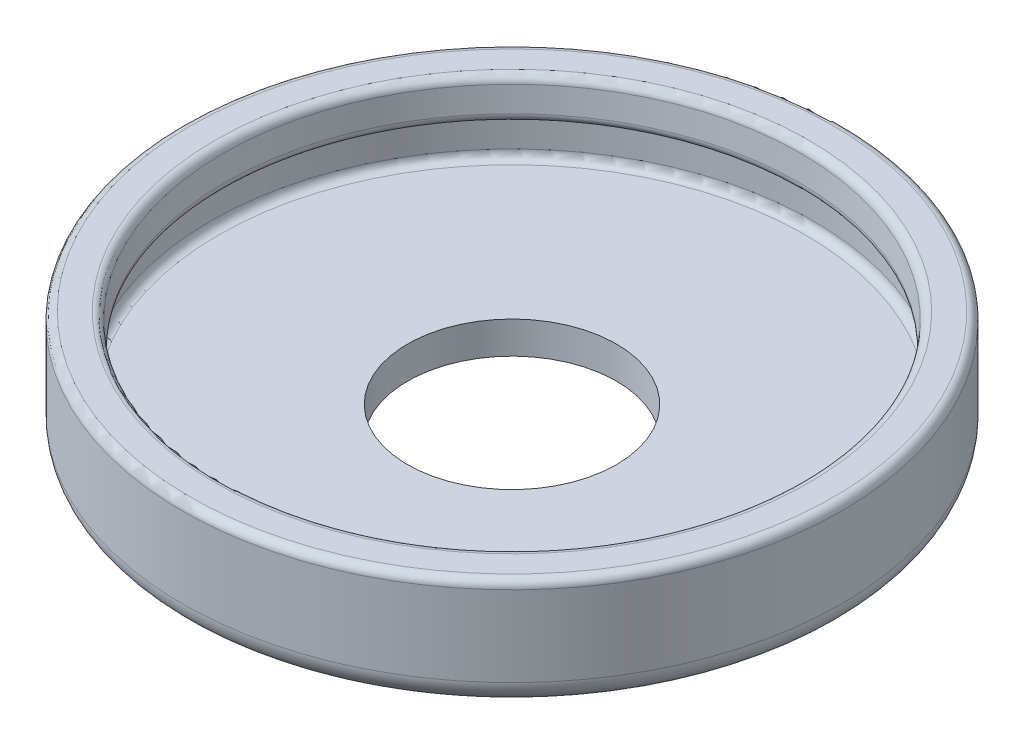
ISO-10303-21;
HEADER;
FILE_DESCRIPTION(('STEP AP214'),'2;1');
FILE_NAME('part.step','',(''),(''),'','','');
FILE_SCHEMA(('AUTOMOTIVE_DESIGN { 1 0 10303 214 1 1 1 1 }'));
ENDSEC;
DATA;
#1=APPLICATION_CONTEXT('core data for automotive mechanical design processes');
#2=APPLICATION_PROTOCOL_DEFINITION('international standard','automotive_design',2000,#1);
#3=PRODUCT_CONTEXT('',#1,'mechanical');
#4=PRODUCT('Part','Part','',(#3));
#5=PRODUCT_RELATED_PRODUCT_CATEGORY('part','',(#4));
#6=PRODUCT_DEFINITION_FORMATION('','',#4);
#7=PRODUCT_DEFINITION_CONTEXT('part definition',#1,'design');
#8=PRODUCT_DEFINITION('design','',#6,#7);
#9=PRODUCT_DEFINITION_SHAPE('','',#8);
#10=(LENGTH_UNIT() NAMED_UNIT(*) SI_UNIT(.MILLI.,.METRE.));
#11=(NAMED_UNIT(*) PLANE_ANGLE_UNIT() SI_UNIT($,.RADIAN.));
#12=(NAMED_UNIT(*) SI_UNIT($,.STERADIAN.) SOLID_ANGLE_UNIT());
#13=UNCERTAINTY_MEASURE_WITH_UNIT(LENGTH_MEASURE(1.E-05),#10,'distance_accuracy_value','');
#14=(GEOMETRIC_REPRESENTATION_CONTEXT(3) GLOBAL_UNCERTAINTY_ASSIGNED_CONTEXT((#13)) GLOBAL_UNIT_ASSIGNED_CONTEXT((#10,
#11,#12)) REPRESENTATION_CONTEXT('',''));
#15=CARTESIAN_POINT('',(0.,0.,0.));
#16=DIRECTION('',(0.,0.,1.));
#17=DIRECTION('',(1.,0.,0.));
#18=AXIS2_PLACEMENT_3D('',#15,#16,#17);
#19=CARTESIAN_POINT('',(0.,-28.2915831066601,0.));
#20=DIRECTION('',(0.,-1.,0.));
#21=DIRECTION('',(1.,0.,0.));
#22=AXIS2_PLACEMENT_3D('',#19,#20,#21);
#23=CYLINDRICAL_SURFACE('',#22,1.651);
#24=CARTESIAN_POINT('',(0.,0.,0.));
#25=DIRECTION('',(0.,-1.,0.));
#26=DIRECTION('',(1.,0.,0.));
#27=AXIS2_PLACEMENT_3D('',#24,#25,#26);
#28=CIRCLE('',#27,1.651);
#29=CARTESIAN_POINT('',(1.651,0.,0.));
#30=VERTEX_POINT('',#29);
#31=EDGE_CURVE('E72',#30,#30,#28,.T.);
#32=ORIENTED_EDGE('',*,*,#31,.T.);
#33=EDGE_LOOP('',(#32));
#34=FACE_BOUND('',#33,.T.);
#35=CARTESIAN_POINT('',(0.,0.507999999999995,0.));
#36=DIRECTION('',(0.,-1.,0.));
#37=DIRECTION('',(1.,0.,0.));
#38=AXIS2_PLACEMENT_3D('',#35,#36,#37);
#39=CIRCLE('',#38,1.651);
#40=CARTESIAN_POINT('',(1.651,0.508,0.));
#41=VERTEX_POINT('',#40);
#42=EDGE_CURVE('E78',#41,#41,#39,.T.);
#43=ORIENTED_EDGE('',*,*,#42,.F.);
#44=EDGE_LOOP('',(#43));
#45=FACE_BOUND('',#44,.T.);
#46=ADVANCED_FACE('F34',(#34,#45),#23,.F.);
#47=CARTESIAN_POINT('',(1.651,0.,0.));
#48=DIRECTION('',(0.,-1.,0.));
#49=DIRECTION('',(1.,0.,0.));
#50=AXIS2_PLACEMENT_3D('',#47,#48,#49);
#51=PLANE('',#50);
#52=CARTESIAN_POINT('',(0.,0.,0.));
#53=DIRECTION('',(0.,-1.,0.));
#54=DIRECTION('',(1.,0.,0.));
#55=AXIS2_PLACEMENT_3D('',#52,#53,#54);
#56=CIRCLE('',#55,4.826);
#57=CARTESIAN_POINT('',(4.826,0.,0.));
#58=VERTEX_POINT('',#57);
#59=EDGE_CURVE('E69',#58,#58,#56,.T.);
#60=ORIENTED_EDGE('',*,*,#59,.T.);
#61=EDGE_LOOP('',(#60));
#62=FACE_BOUND('',#61,.T.);
#63=ORIENTED_EDGE('',*,*,#31,.F.);
#64=EDGE_LOOP('',(#63));
#65=FACE_BOUND('',#64,.T.);
#66=ADVANCED_FACE('F85',(#62,#65),#51,.T.);
#67=CARTESIAN_POINT('',(0.,-28.2915831066601,0.));
#68=DIRECTION('',(0.,-1.,0.));
#69=DIRECTION('',(1.,0.,0.));
#70=AXIS2_PLACEMENT_3D('',#67,#68,#69);
#71=CYLINDRICAL_SURFACE('',#70,5.207);
#72=CARTESIAN_POINT('',(0.,1.65099999999998,0.));
#73=DIRECTION('',(0.,1.,0.));
#74=DIRECTION('',(-1.,0.,0.));
#75=AXIS2_PLACEMENT_3D('',#72,#73,#74);
#76=CIRCLE('',#75,5.207);
#77=CARTESIAN_POINT('',(-5.20700000000001,1.65099999999996,0.));
#78=VERTEX_POINT('',#77);
#79=EDGE_CURVE('E10',#78,#78,#76,.F.);
#80=ORIENTED_EDGE('',*,*,#79,.T.);
#81=EDGE_LOOP('',(#80));
#82=FACE_BOUND('',#81,.T.);
#83=CARTESIAN_POINT('',(0.,0.380999999999986,0.));
#84=DIRECTION('',(0.,-1.,0.));
#85=DIRECTION('',(1.,0.,0.));
#86=AXIS2_PLACEMENT_3D('',#83,#84,#85);
#87=CIRCLE('',#86,5.207);
#88=CARTESIAN_POINT('',(5.207,0.381000000000003,0.));
#89=VERTEX_POINT('',#88);
#90=EDGE_CURVE('E66',#89,#89,#87,.F.);
#91=ORIENTED_EDGE('',*,*,#90,.T.);
#92=EDGE_LOOP('',(#91));
#93=FACE_BOUND('',#92,.T.);
#94=ADVANCED_FACE('F92',(#82,#93),#71,.T.);
#95=CARTESIAN_POINT('',(5.207,1.778,0.));
#96=DIRECTION('',(0.,1.,0.));
#97=DIRECTION('',(-1.,0.,0.));
#98=AXIS2_PLACEMENT_3D('',#95,#96,#97);
#99=PLANE('',#98);
#100=CARTESIAN_POINT('',(0.,1.77799999999998,0.));
#101=DIRECTION('',(0.,1.,0.));
#102=DIRECTION('',(-1.,0.,0.));
#103=AXIS2_PLACEMENT_3D('',#100,#101,#102);
#104=CIRCLE('',#103,4.68924575183249);
#105=CARTESIAN_POINT('',(-4.68924575183249,1.77799999999997,0.));
#106=VERTEX_POINT('',#105);
#107=EDGE_CURVE('E41',#106,#106,#104,.F.);
#108=ORIENTED_EDGE('',*,*,#107,.T.);
#109=EDGE_LOOP('',(#108));
#110=FACE_BOUND('',#109,.T.);
#111=CARTESIAN_POINT('',(0.,1.77799999999998,0.));
#112=DIRECTION('',(0.,1.,0.));
#113=DIRECTION('',(-1.,0.,0.));
#114=AXIS2_PLACEMENT_3D('',#111,#112,#113);
#115=CIRCLE('',#114,5.08);
#116=CARTESIAN_POINT('',(-5.08000000000001,1.77799999999997,0.));
#117=VERTEX_POINT('',#116);
#118=EDGE_CURVE('E45',#117,#117,#115,.T.);
#119=ORIENTED_EDGE('',*,*,#118,.T.);
#120=EDGE_LOOP('',(#119));
#121=FACE_BOUND('',#120,.T.);
#122=ADVANCED_FACE('F121',(#110,#121),#99,.T.);
#123=CARTESIAN_POINT('',(0.,1.77799999999998,0.));
#124=DIRECTION('',(0.,1.,0.));
#125=DIRECTION('',(-1.,0.,0.));
#126=AXIS2_PLACEMENT_3D('',#123,#124,#125);
#127=CONICAL_SURFACE('',#126,4.57200000000001,0.0798299857122402);
#128=CARTESIAN_POINT('',(0.,1.28012764322991,0.));
#129=DIRECTION('',(0.,-1.,0.));
#130=DIRECTION('',(1.,0.,0.));
#131=AXIS2_PLACEMENT_3D('',#128,#129,#130);
#132=CIRCLE('',#131,4.5321702114584);
#133=CARTESIAN_POINT('',(4.53217021145839,1.28012764322993,0.));
#134=VERTEX_POINT('',#133);
#135=EDGE_CURVE('E54',#134,#134,#132,.T.);
#136=ORIENTED_EDGE('',*,*,#135,.T.);
#137=EDGE_LOOP('',(#136));
#138=FACE_BOUND('',#137,.T.);
#139=CARTESIAN_POINT('',(0.,1.66112764322991,0.));
#140=DIRECTION('',(0.,-1.,0.));
#141=DIRECTION('',(1.,0.,0.));
#142=AXIS2_PLACEMENT_3D('',#139,#140,#141);
#143=CIRCLE('',#142,4.5626502114584);
#144=CARTESIAN_POINT('',(4.56265021145839,1.66112764322993,0.));
#145=VERTEX_POINT('',#144);
#146=EDGE_CURVE('E57',#145,#145,#143,.F.);
#147=ORIENTED_EDGE('',*,*,#146,.T.);
#148=EDGE_LOOP('',(#147));
#149=FACE_BOUND('',#148,.T.);
#150=ADVANCED_FACE('F118',(#138,#149),#127,.F.);
#151=CARTESIAN_POINT('',(4.5212,1.143,0.));
#152=DIRECTION('',(0.,-1.,0.));
#153=DIRECTION('',(1.,0.,0.));
#154=AXIS2_PLACEMENT_3D('',#151,#152,#153);
#155=PLANE('',#154);
#156=CARTESIAN_POINT('',(0.,1.14299999999998,0.));
#157=DIRECTION('',(0.,-1.,0.));
#158=DIRECTION('',(1.,0.,0.));
#159=AXIS2_PLACEMENT_3D('',#156,#157,#158);
#160=CIRCLE('',#159,4.65876575183249);
#161=CARTESIAN_POINT('',(4.65876575183248,1.143,0.));
#162=VERTEX_POINT('',#161);
#163=EDGE_CURVE('E49',#162,#162,#160,.F.);
#164=ORIENTED_EDGE('',*,*,#163,.T.);
#165=EDGE_LOOP('',(#164));
#166=FACE_BOUND('',#165,.T.);
#167=CARTESIAN_POINT('',(0.,1.14299999999998,0.));
#168=DIRECTION('',(0.,-1.,0.));
#169=DIRECTION('',(1.,0.,0.));
#170=AXIS2_PLACEMENT_3D('',#167,#168,#169);
#171=CIRCLE('',#170,4.7625);
#172=CARTESIAN_POINT('',(4.7625,1.143,0.));
#173=VERTEX_POINT('',#172);
#174=EDGE_CURVE('E75',#173,#173,#171,.T.);
#175=ORIENTED_EDGE('',*,*,#174,.T.);
#176=EDGE_LOOP('',(#175));
#177=FACE_BOUND('',#176,.T.);
#178=ADVANCED_FACE('F120',(#166,#177),#155,.T.);
#179=CARTESIAN_POINT('',(0.,-28.2915831066601,0.));
#180=DIRECTION('',(0.,-1.,0.));
#181=DIRECTION('',(1.,0.,0.));
#182=AXIS2_PLACEMENT_3D('',#179,#180,#181);
#183=CYLINDRICAL_SURFACE('',#182,4.7625);
#184=CARTESIAN_POINT('',(0.,0.63499999999999,0.));
#185=DIRECTION('',(0.,1.,0.));
#186=DIRECTION('',(-1.,0.,0.));
#187=AXIS2_PLACEMENT_3D('',#184,#185,#186);
#188=CIRCLE('',#187,4.7625);
#189=CARTESIAN_POINT('',(-4.76250000000001,0.634999999999973,0.));
#190=VERTEX_POINT('',#189);
#191=EDGE_CURVE('E63',#190,#190,#188,.F.);
#192=ORIENTED_EDGE('',*,*,#191,.T.);
#193=EDGE_LOOP('',(#192));
#194=FACE_BOUND('',#193,.T.);
#195=ORIENTED_EDGE('',*,*,#174,.F.);
#196=EDGE_LOOP('',(#195));
#197=FACE_BOUND('',#196,.T.);
#198=ADVANCED_FACE('F128',(#194,#197),#183,.F.);
#199=CARTESIAN_POINT('',(4.7625,0.508000000000006,0.));
#200=DIRECTION('',(0.,1.,0.));
#201=DIRECTION('',(-1.,0.,0.));
#202=AXIS2_PLACEMENT_3D('',#199,#200,#201);
#203=PLANE('',#202);
#204=CARTESIAN_POINT('',(0.,0.507999999999989,0.));
#205=DIRECTION('',(0.,1.,0.));
#206=DIRECTION('',(-1.,0.,0.));
#207=AXIS2_PLACEMENT_3D('',#204,#205,#206);
#208=CIRCLE('',#207,4.6355);
#209=CARTESIAN_POINT('',(-4.6355,0.507999999999973,0.));
#210=VERTEX_POINT('',#209);
#211=EDGE_CURVE('E60',#210,#210,#208,.T.);
#212=ORIENTED_EDGE('',*,*,#211,.T.);
#213=EDGE_LOOP('',(#212));
#214=FACE_BOUND('',#213,.T.);
#215=ORIENTED_EDGE('',*,*,#42,.T.);
#216=EDGE_LOOP('',(#215));
#217=FACE_BOUND('',#216,.T.);
#218=ADVANCED_FACE('F82',(#214,#217),#203,.T.);
#219=CARTESIAN_POINT('',(0.,0.380999999999986,0.));
#220=DIRECTION('',(0.,-1.,0.));
#221=DIRECTION('',(1.,0.,0.));
#222=AXIS2_PLACEMENT_3D('',#219,#220,#221);
#223=TOROIDAL_SURFACE('',#222,4.826,0.381);
#224=ORIENTED_EDGE('',*,*,#90,.F.);
#225=EDGE_LOOP('',(#224));
#226=FACE_BOUND('',#225,.T.);
#227=ORIENTED_EDGE('',*,*,#59,.F.);
#228=EDGE_LOOP('',(#227));
#229=FACE_BOUND('',#228,.T.);
#230=ADVANCED_FACE('F97',(#226,#229),#223,.T.);
#231=CARTESIAN_POINT('',(0.,0.63499999999999,0.));
#232=DIRECTION('',(0.,1.,0.));
#233=DIRECTION('',(-1.,0.,0.));
#234=AXIS2_PLACEMENT_3D('',#231,#232,#233);
#235=TOROIDAL_SURFACE('',#234,4.6355,0.127);
#236=ORIENTED_EDGE('',*,*,#211,.F.);
#237=EDGE_LOOP('',(#236));
#238=FACE_BOUND('',#237,.T.);
#239=ORIENTED_EDGE('',*,*,#191,.F.);
#240=EDGE_LOOP('',(#239));
#241=FACE_BOUND('',#240,.T.);
#242=ADVANCED_FACE('F100',(#238,#241),#235,.F.);
#243=CARTESIAN_POINT('',(0.,1.26999999999998,0.));
#244=DIRECTION('',(0.,-1.,0.));
#245=DIRECTION('',(1.,0.,0.));
#246=AXIS2_PLACEMENT_3D('',#243,#244,#245);
#247=TOROIDAL_SURFACE('',#246,4.65876575183249,0.127);
#248=ORIENTED_EDGE('',*,*,#163,.F.);
#249=EDGE_LOOP('',(#248));
#250=FACE_BOUND('',#249,.T.);
#251=ORIENTED_EDGE('',*,*,#135,.F.);
#252=EDGE_LOOP('',(#251));
#253=FACE_BOUND('',#252,.T.);
#254=ADVANCED_FACE('F104',(#250,#253),#247,.T.);
#255=CARTESIAN_POINT('',(0.,1.65099999999998,0.));
#256=DIRECTION('',(0.,1.,0.));
#257=DIRECTION('',(-1.,0.,0.));
#258=AXIS2_PLACEMENT_3D('',#255,#256,#257);
#259=TOROIDAL_SURFACE('',#258,4.68924575183249,0.127);
#260=ORIENTED_EDGE('',*,*,#146,.F.);
#261=EDGE_LOOP('',(#260));
#262=FACE_BOUND('',#261,.T.);
#263=ORIENTED_EDGE('',*,*,#107,.F.);
#264=EDGE_LOOP('',(#263));
#265=FACE_BOUND('',#264,.T.);
#266=ADVANCED_FACE('F107',(#262,#265),#259,.T.);
#267=CARTESIAN_POINT('',(0.,1.65099999999998,0.));
#268=DIRECTION('',(0.,1.,0.));
#269=DIRECTION('',(-1.,0.,0.));
#270=AXIS2_PLACEMENT_3D('',#267,#268,#269);
#271=TOROIDAL_SURFACE('',#270,5.08,0.127);
#272=ORIENTED_EDGE('',*,*,#118,.F.);
#273=EDGE_LOOP('',(#272));
#274=FACE_BOUND('',#273,.T.);
#275=ORIENTED_EDGE('',*,*,#79,.F.);
#276=EDGE_LOOP('',(#275));
#277=FACE_BOUND('',#276,.T.);
#278=ADVANCED_FACE('F36',(#274,#277),#271,.T.);
#279=CLOSED_SHELL('',(#46,#66,#94,#122,#150,#178,#198,#218,#230,#242,#254,#266,#278));
#280=MANIFOLD_SOLID_BREP('B2',#279);
#281=ADVANCED_BREP_SHAPE_REPRESENTATION('',(#18,#280),#14);
#282=SHAPE_DEFINITION_REPRESENTATION(#9,#281);
ENDSEC;
END-ISO-10303-21;
